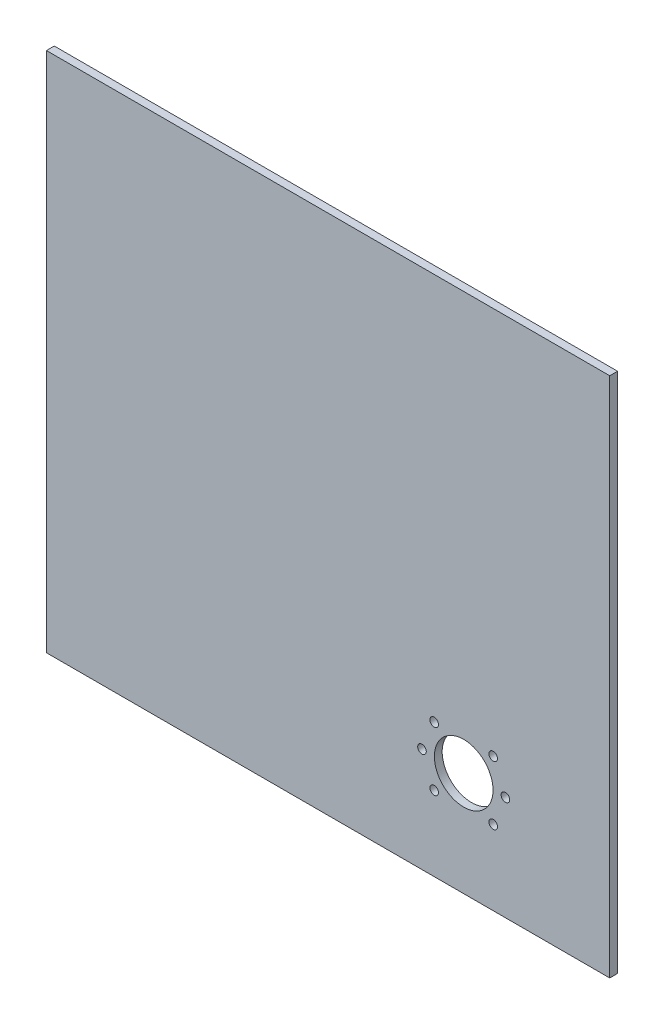
ISO-10303-21;
HEADER;
FILE_DESCRIPTION(('STEP AP214'),'2;1');
FILE_NAME('part.step','',(''),(''),'','','');
FILE_SCHEMA(('AUTOMOTIVE_DESIGN { 1 0 10303 214 1 1 1 1 }'));
ENDSEC;
DATA;
#1=APPLICATION_CONTEXT('core data for automotive mechanical design processes');
#2=APPLICATION_PROTOCOL_DEFINITION('international standard','automotive_design',2000,#1);
#3=PRODUCT_CONTEXT('',#1,'mechanical');
#4=PRODUCT('Part','Part','',(#3));
#5=PRODUCT_RELATED_PRODUCT_CATEGORY('part','',(#4));
#6=PRODUCT_DEFINITION_FORMATION('','',#4);
#7=PRODUCT_DEFINITION_CONTEXT('part definition',#1,'design');
#8=PRODUCT_DEFINITION('design','',#6,#7);
#9=PRODUCT_DEFINITION_SHAPE('','',#8);
#10=(LENGTH_UNIT() NAMED_UNIT(*) SI_UNIT(.MILLI.,.METRE.));
#11=(NAMED_UNIT(*) PLANE_ANGLE_UNIT() SI_UNIT($,.RADIAN.));
#12=(NAMED_UNIT(*) SI_UNIT($,.STERADIAN.) SOLID_ANGLE_UNIT());
#13=UNCERTAINTY_MEASURE_WITH_UNIT(LENGTH_MEASURE(1.E-05),#10,'distance_accuracy_value','');
#14=(GEOMETRIC_REPRESENTATION_CONTEXT(3) GLOBAL_UNCERTAINTY_ASSIGNED_CONTEXT((#13)) GLOBAL_UNIT_ASSIGNED_CONTEXT((#10,
#11,#12)) REPRESENTATION_CONTEXT('',''));
#15=CARTESIAN_POINT('',(0.,0.,0.));
#16=DIRECTION('',(0.,0.,1.));
#17=DIRECTION('',(1.,0.,0.));
#18=AXIS2_PLACEMENT_3D('',#15,#16,#17);
#19=CARTESIAN_POINT('',(108.,100.,3.));
#20=DIRECTION('',(-1.,0.,0.));
#21=DIRECTION('',(0.,-1.,0.));
#22=AXIS2_PLACEMENT_3D('',#19,#20,#21);
#23=PLANE('',#22);
#24=DIRECTION('',(0.,1.,0.));
#25=VECTOR('',#24,1.);
#26=CARTESIAN_POINT('',(108.,100.,0.));
#27=LINE('',#26,#25);
#28=CARTESIAN_POINT('',(108.,-100.,0.));
#29=VERTEX_POINT('',#28);
#30=CARTESIAN_POINT('',(108.,100.,0.));
#31=VERTEX_POINT('',#30);
#32=EDGE_CURVE('E98',#29,#31,#27,.T.);
#33=ORIENTED_EDGE('',*,*,#32,.T.);
#34=DIRECTION('',(0.,0.,-1.));
#35=VECTOR('',#34,1.);
#36=CARTESIAN_POINT('',(108.,100.,3.));
#37=LINE('',#36,#35);
#38=CARTESIAN_POINT('',(108.,100.,3.));
#39=VERTEX_POINT('',#38);
#40=EDGE_CURVE('E11',#39,#31,#37,.T.);
#41=ORIENTED_EDGE('',*,*,#40,.F.);
#42=DIRECTION('',(0.,1.,0.));
#43=VECTOR('',#42,1.);
#44=CARTESIAN_POINT('',(108.,100.,3.));
#45=LINE('',#44,#43);
#46=CARTESIAN_POINT('',(108.,-100.,3.));
#47=VERTEX_POINT('',#46);
#48=EDGE_CURVE('E86',#47,#39,#45,.T.);
#49=ORIENTED_EDGE('',*,*,#48,.F.);
#50=DIRECTION('',(0.,0.,-1.));
#51=VECTOR('',#50,1.);
#52=CARTESIAN_POINT('',(108.,-100.,3.));
#53=LINE('',#52,#51);
#54=EDGE_CURVE('E94',#47,#29,#53,.T.);
#55=ORIENTED_EDGE('',*,*,#54,.T.);
#56=EDGE_LOOP('',(#33,#41,#49,#55));
#57=FACE_BOUND('',#56,.T.);
#58=ADVANCED_FACE('F35',(#57),#23,.F.);
#59=CARTESIAN_POINT('',(-108.,100.,3.));
#60=DIRECTION('',(0.,-1.,0.));
#61=DIRECTION('',(0.,0.,-1.));
#62=AXIS2_PLACEMENT_3D('',#59,#60,#61);
#63=PLANE('',#62);
#64=DIRECTION('',(-1.,0.,0.));
#65=VECTOR('',#64,1.);
#66=CARTESIAN_POINT('',(-108.,100.,0.));
#67=LINE('',#66,#65);
#68=CARTESIAN_POINT('',(-108.,100.,0.));
#69=VERTEX_POINT('',#68);
#70=EDGE_CURVE('E90',#31,#69,#67,.T.);
#71=ORIENTED_EDGE('',*,*,#70,.T.);
#72=DIRECTION('',(0.,0.,-1.));
#73=VECTOR('',#72,1.);
#74=CARTESIAN_POINT('',(-108.,100.,3.));
#75=LINE('',#74,#73);
#76=CARTESIAN_POINT('',(-108.,100.,3.));
#77=VERTEX_POINT('',#76);
#78=EDGE_CURVE('E43',#77,#69,#75,.T.);
#79=ORIENTED_EDGE('',*,*,#78,.F.);
#80=DIRECTION('',(-1.,0.,0.));
#81=VECTOR('',#80,1.);
#82=CARTESIAN_POINT('',(-108.,100.,3.));
#83=LINE('',#82,#81);
#84=EDGE_CURVE('E81',#39,#77,#83,.T.);
#85=ORIENTED_EDGE('',*,*,#84,.F.);
#86=ORIENTED_EDGE('',*,*,#40,.T.);
#87=EDGE_LOOP('',(#71,#79,#85,#86));
#88=FACE_BOUND('',#87,.T.);
#89=ADVANCED_FACE('F89',(#88),#63,.F.);
#90=CARTESIAN_POINT('',(-108.,100.,3.));
#91=DIRECTION('',(1.,0.,0.));
#92=DIRECTION('',(0.,1.,0.));
#93=AXIS2_PLACEMENT_3D('',#90,#91,#92);
#94=PLANE('',#93);
#95=DIRECTION('',(0.,-1.,0.));
#96=VECTOR('',#95,1.);
#97=CARTESIAN_POINT('',(-108.,100.,0.));
#98=LINE('',#97,#96);
#99=CARTESIAN_POINT('',(-108.,-100.,0.));
#100=VERTEX_POINT('',#99);
#101=EDGE_CURVE('E68',#69,#100,#98,.T.);
#102=ORIENTED_EDGE('',*,*,#101,.T.);
#103=DIRECTION('',(0.,0.,-1.));
#104=VECTOR('',#103,1.);
#105=CARTESIAN_POINT('',(-108.,-100.,3.));
#106=LINE('',#105,#104);
#107=CARTESIAN_POINT('',(-108.,-100.,3.));
#108=VERTEX_POINT('',#107);
#109=EDGE_CURVE('E91',#108,#100,#106,.T.);
#110=ORIENTED_EDGE('',*,*,#109,.F.);
#111=DIRECTION('',(0.,-1.,0.));
#112=VECTOR('',#111,1.);
#113=CARTESIAN_POINT('',(-108.,100.,3.));
#114=LINE('',#113,#112);
#115=EDGE_CURVE('E84',#77,#108,#114,.T.);
#116=ORIENTED_EDGE('',*,*,#115,.F.);
#117=ORIENTED_EDGE('',*,*,#78,.T.);
#118=EDGE_LOOP('',(#102,#110,#116,#117));
#119=FACE_BOUND('',#118,.T.);
#120=ADVANCED_FACE('F92',(#119),#94,.F.);
#121=CARTESIAN_POINT('',(-108.,-100.,3.));
#122=DIRECTION('',(0.,1.,0.));
#123=DIRECTION('',(0.,0.,1.));
#124=AXIS2_PLACEMENT_3D('',#121,#122,#123);
#125=PLANE('',#124);
#126=DIRECTION('',(1.,0.,0.));
#127=VECTOR('',#126,1.);
#128=CARTESIAN_POINT('',(-108.,-100.,0.));
#129=LINE('',#128,#127);
#130=EDGE_CURVE('E74',#100,#29,#129,.T.);
#131=ORIENTED_EDGE('',*,*,#130,.T.);
#132=ORIENTED_EDGE('',*,*,#54,.F.);
#133=DIRECTION('',(1.,0.,0.));
#134=VECTOR('',#133,1.);
#135=CARTESIAN_POINT('',(-108.,-100.,3.));
#136=LINE('',#135,#134);
#137=EDGE_CURVE('E51',#108,#47,#136,.T.);
#138=ORIENTED_EDGE('',*,*,#137,.F.);
#139=ORIENTED_EDGE('',*,*,#109,.T.);
#140=EDGE_LOOP('',(#131,#132,#138,#139));
#141=FACE_BOUND('',#140,.T.);
#142=ADVANCED_FACE('F106',(#141),#125,.F.);
#143=CARTESIAN_POINT('',(0.,0.,3.));
#144=DIRECTION('',(0.,0.,1.));
#145=DIRECTION('',(1.,0.,0.));
#146=AXIS2_PLACEMENT_3D('',#143,#144,#145);
#147=PLANE('',#146);
#148=CARTESIAN_POINT('',(36.,-60.,3.));
#149=DIRECTION('',(0.,0.,1.));
#150=DIRECTION('',(1.,0.,0.));
#151=AXIS2_PLACEMENT_3D('',#148,#149,#150);
#152=CIRCLE('',#151,1.64999999999998);
#153=CARTESIAN_POINT('',(37.65,-60.,3.));
#154=VERTEX_POINT('',#153);
#155=EDGE_CURVE('E150',#154,#154,#152,.T.);
#156=ORIENTED_EDGE('',*,*,#155,.F.);
#157=EDGE_LOOP('',(#156));
#158=FACE_BOUND('',#157,.T.);
#159=CARTESIAN_POINT('',(40.6862915010152,-48.6862915010152,3.));
#160=DIRECTION('',(0.,0.,1.));
#161=DIRECTION('',(1.,0.,0.));
#162=AXIS2_PLACEMENT_3D('',#159,#160,#161);
#163=CIRCLE('',#162,1.64999999999998);
#164=CARTESIAN_POINT('',(42.3362915010152,-48.6862915010152,3.));
#165=VERTEX_POINT('',#164);
#166=EDGE_CURVE('E144',#165,#165,#163,.T.);
#167=ORIENTED_EDGE('',*,*,#166,.F.);
#168=EDGE_LOOP('',(#167));
#169=FACE_BOUND('',#168,.T.);
#170=CARTESIAN_POINT('',(40.6862915010152,-71.3137084989848,3.));
#171=DIRECTION('',(0.,0.,1.));
#172=DIRECTION('',(1.,0.,0.));
#173=AXIS2_PLACEMENT_3D('',#170,#171,#172);
#174=CIRCLE('',#173,1.64999999999998);
#175=CARTESIAN_POINT('',(42.3362915010152,-71.3137084989848,3.));
#176=VERTEX_POINT('',#175);
#177=EDGE_CURVE('E138',#176,#176,#174,.T.);
#178=ORIENTED_EDGE('',*,*,#177,.F.);
#179=EDGE_LOOP('',(#178));
#180=FACE_BOUND('',#179,.T.);
#181=CARTESIAN_POINT('',(63.3137084989847,-48.6862915010152,3.));
#182=DIRECTION('',(0.,0.,1.));
#183=DIRECTION('',(1.,0.,0.));
#184=AXIS2_PLACEMENT_3D('',#181,#182,#183);
#185=CIRCLE('',#184,1.64999999999998);
#186=CARTESIAN_POINT('',(64.9637084989847,-48.6862915010152,3.));
#187=VERTEX_POINT('',#186);
#188=EDGE_CURVE('E132',#187,#187,#185,.T.);
#189=ORIENTED_EDGE('',*,*,#188,.F.);
#190=EDGE_LOOP('',(#189));
#191=FACE_BOUND('',#190,.T.);
#192=CARTESIAN_POINT('',(68.,-60.,3.));
#193=DIRECTION('',(0.,0.,1.));
#194=DIRECTION('',(1.,0.,0.));
#195=AXIS2_PLACEMENT_3D('',#192,#193,#194);
#196=CIRCLE('',#195,1.64999999999998);
#197=CARTESIAN_POINT('',(69.65,-60.,3.));
#198=VERTEX_POINT('',#197);
#199=EDGE_CURVE('E126',#198,#198,#196,.T.);
#200=ORIENTED_EDGE('',*,*,#199,.F.);
#201=EDGE_LOOP('',(#200));
#202=FACE_BOUND('',#201,.T.);
#203=CARTESIAN_POINT('',(63.3137084989848,-71.3137084989848,3.));
#204=DIRECTION('',(0.,0.,1.));
#205=DIRECTION('',(1.,0.,0.));
#206=AXIS2_PLACEMENT_3D('',#203,#204,#205);
#207=CIRCLE('',#206,1.64999999999998);
#208=CARTESIAN_POINT('',(64.9637084989847,-71.3137084989848,3.));
#209=VERTEX_POINT('',#208);
#210=EDGE_CURVE('E120',#209,#209,#207,.T.);
#211=ORIENTED_EDGE('',*,*,#210,.F.);
#212=EDGE_LOOP('',(#211));
#213=FACE_BOUND('',#212,.T.);
#214=CARTESIAN_POINT('',(52.,-60.,3.));
#215=DIRECTION('',(0.,0.,1.));
#216=DIRECTION('',(1.,0.,0.));
#217=AXIS2_PLACEMENT_3D('',#214,#215,#216);
#218=CIRCLE('',#217,11.25);
#219=CARTESIAN_POINT('',(63.25,-60.,3.));
#220=VERTEX_POINT('',#219);
#221=EDGE_CURVE('E112',#220,#220,#218,.T.);
#222=ORIENTED_EDGE('',*,*,#221,.F.);
#223=EDGE_LOOP('',(#222));
#224=FACE_BOUND('',#223,.T.);
#225=ORIENTED_EDGE('',*,*,#48,.T.);
#226=ORIENTED_EDGE('',*,*,#84,.T.);
#227=ORIENTED_EDGE('',*,*,#115,.T.);
#228=ORIENTED_EDGE('',*,*,#137,.T.);
#229=EDGE_LOOP('',(#225,#226,#227,#228));
#230=FACE_BOUND('',#229,.T.);
#231=ADVANCED_FACE('F82',(#158,#169,#180,#191,#202,#213,#224,#230),#147,.T.);
#232=CARTESIAN_POINT('',(0.,0.,0.));
#233=DIRECTION('',(0.,0.,1.));
#234=DIRECTION('',(1.,0.,0.));
#235=AXIS2_PLACEMENT_3D('',#232,#233,#234);
#236=PLANE('',#235);
#237=CARTESIAN_POINT('',(36.,-60.,0.));
#238=DIRECTION('',(0.,0.,1.));
#239=DIRECTION('',(1.,0.,0.));
#240=AXIS2_PLACEMENT_3D('',#237,#238,#239);
#241=CIRCLE('',#240,1.65);
#242=CARTESIAN_POINT('',(37.65,-60.,0.));
#243=VERTEX_POINT('',#242);
#244=EDGE_CURVE('E147',#243,#243,#241,.T.);
#245=ORIENTED_EDGE('',*,*,#244,.T.);
#246=EDGE_LOOP('',(#245));
#247=FACE_BOUND('',#246,.T.);
#248=CARTESIAN_POINT('',(40.6862915010152,-48.6862915010152,0.));
#249=DIRECTION('',(0.,0.,1.));
#250=DIRECTION('',(1.,0.,0.));
#251=AXIS2_PLACEMENT_3D('',#248,#249,#250);
#252=CIRCLE('',#251,1.65);
#253=CARTESIAN_POINT('',(42.3362915010152,-48.6862915010152,0.));
#254=VERTEX_POINT('',#253);
#255=EDGE_CURVE('E141',#254,#254,#252,.T.);
#256=ORIENTED_EDGE('',*,*,#255,.T.);
#257=EDGE_LOOP('',(#256));
#258=FACE_BOUND('',#257,.T.);
#259=CARTESIAN_POINT('',(40.6862915010152,-71.3137084989848,0.));
#260=DIRECTION('',(0.,0.,1.));
#261=DIRECTION('',(1.,0.,0.));
#262=AXIS2_PLACEMENT_3D('',#259,#260,#261);
#263=CIRCLE('',#262,1.65);
#264=CARTESIAN_POINT('',(42.3362915010152,-71.3137084989848,0.));
#265=VERTEX_POINT('',#264);
#266=EDGE_CURVE('E135',#265,#265,#263,.T.);
#267=ORIENTED_EDGE('',*,*,#266,.T.);
#268=EDGE_LOOP('',(#267));
#269=FACE_BOUND('',#268,.T.);
#270=CARTESIAN_POINT('',(63.3137084989847,-48.6862915010152,0.));
#271=DIRECTION('',(0.,0.,1.));
#272=DIRECTION('',(1.,0.,0.));
#273=AXIS2_PLACEMENT_3D('',#270,#271,#272);
#274=CIRCLE('',#273,1.65);
#275=CARTESIAN_POINT('',(64.9637084989847,-48.6862915010152,0.));
#276=VERTEX_POINT('',#275);
#277=EDGE_CURVE('E129',#276,#276,#274,.T.);
#278=ORIENTED_EDGE('',*,*,#277,.T.);
#279=EDGE_LOOP('',(#278));
#280=FACE_BOUND('',#279,.T.);
#281=CARTESIAN_POINT('',(68.,-60.,0.));
#282=DIRECTION('',(0.,0.,1.));
#283=DIRECTION('',(1.,0.,0.));
#284=AXIS2_PLACEMENT_3D('',#281,#282,#283);
#285=CIRCLE('',#284,1.65);
#286=CARTESIAN_POINT('',(69.65,-60.,0.));
#287=VERTEX_POINT('',#286);
#288=EDGE_CURVE('E123',#287,#287,#285,.T.);
#289=ORIENTED_EDGE('',*,*,#288,.T.);
#290=EDGE_LOOP('',(#289));
#291=FACE_BOUND('',#290,.T.);
#292=CARTESIAN_POINT('',(63.3137084989848,-71.3137084989848,0.));
#293=DIRECTION('',(0.,0.,1.));
#294=DIRECTION('',(1.,0.,0.));
#295=AXIS2_PLACEMENT_3D('',#292,#293,#294);
#296=CIRCLE('',#295,1.65);
#297=CARTESIAN_POINT('',(64.9637084989848,-71.3137084989848,0.));
#298=VERTEX_POINT('',#297);
#299=EDGE_CURVE('E115',#298,#298,#296,.T.);
#300=ORIENTED_EDGE('',*,*,#299,.T.);
#301=EDGE_LOOP('',(#300));
#302=FACE_BOUND('',#301,.T.);
#303=CARTESIAN_POINT('',(52.,-60.,0.));
#304=DIRECTION('',(0.,0.,1.));
#305=DIRECTION('',(1.,0.,0.));
#306=AXIS2_PLACEMENT_3D('',#303,#304,#305);
#307=CIRCLE('',#306,11.25);
#308=CARTESIAN_POINT('',(63.25,-60.,0.));
#309=VERTEX_POINT('',#308);
#310=EDGE_CURVE('E101',#309,#309,#307,.T.);
#311=ORIENTED_EDGE('',*,*,#310,.T.);
#312=EDGE_LOOP('',(#311));
#313=FACE_BOUND('',#312,.T.);
#314=ORIENTED_EDGE('',*,*,#32,.F.);
#315=ORIENTED_EDGE('',*,*,#130,.F.);
#316=ORIENTED_EDGE('',*,*,#101,.F.);
#317=ORIENTED_EDGE('',*,*,#70,.F.);
#318=EDGE_LOOP('',(#314,#315,#316,#317));
#319=FACE_BOUND('',#318,.T.);
#320=ADVANCED_FACE('F109',(#247,#258,#269,#280,#291,#302,#313,#319),#236,.F.);
#321=CARTESIAN_POINT('',(52.,-60.,0.));
#322=DIRECTION('',(0.,0.,1.));
#323=DIRECTION('',(1.,0.,0.));
#324=AXIS2_PLACEMENT_3D('',#321,#322,#323);
#325=CYLINDRICAL_SURFACE('',#324,11.25);
#326=ORIENTED_EDGE('',*,*,#310,.F.);
#327=EDGE_LOOP('',(#326));
#328=FACE_BOUND('',#327,.T.);
#329=ORIENTED_EDGE('',*,*,#221,.T.);
#330=EDGE_LOOP('',(#329));
#331=FACE_BOUND('',#330,.T.);
#332=ADVANCED_FACE('F171',(#328,#331),#325,.F.);
#333=CARTESIAN_POINT('',(63.3137084989848,-71.3137084989848,3.));
#334=DIRECTION('',(0.,0.,1.));
#335=DIRECTION('',(1.,0.,0.));
#336=AXIS2_PLACEMENT_3D('',#333,#334,#335);
#337=CYLINDRICAL_SURFACE('',#336,1.64999999999999);
#338=ORIENTED_EDGE('',*,*,#299,.F.);
#339=EDGE_LOOP('',(#338));
#340=FACE_BOUND('',#339,.T.);
#341=ORIENTED_EDGE('',*,*,#210,.T.);
#342=EDGE_LOOP('',(#341));
#343=FACE_BOUND('',#342,.T.);
#344=ADVANCED_FACE('F173',(#340,#343),#337,.F.);
#345=CARTESIAN_POINT('',(68.,-60.,3.));
#346=DIRECTION('',(0.,0.,1.));
#347=DIRECTION('',(1.,0.,0.));
#348=AXIS2_PLACEMENT_3D('',#345,#346,#347);
#349=CYLINDRICAL_SURFACE('',#348,1.64999999999999);
#350=ORIENTED_EDGE('',*,*,#288,.F.);
#351=EDGE_LOOP('',(#350));
#352=FACE_BOUND('',#351,.T.);
#353=ORIENTED_EDGE('',*,*,#199,.T.);
#354=EDGE_LOOP('',(#353));
#355=FACE_BOUND('',#354,.T.);
#356=ADVANCED_FACE('F180',(#352,#355),#349,.F.);
#357=CARTESIAN_POINT('',(63.3137084989847,-48.6862915010152,3.));
#358=DIRECTION('',(0.,0.,1.));
#359=DIRECTION('',(1.,0.,0.));
#360=AXIS2_PLACEMENT_3D('',#357,#358,#359);
#361=CYLINDRICAL_SURFACE('',#360,1.64999999999999);
#362=ORIENTED_EDGE('',*,*,#277,.F.);
#363=EDGE_LOOP('',(#362));
#364=FACE_BOUND('',#363,.T.);
#365=ORIENTED_EDGE('',*,*,#188,.T.);
#366=EDGE_LOOP('',(#365));
#367=FACE_BOUND('',#366,.T.);
#368=ADVANCED_FACE('F226',(#364,#367),#361,.F.);
#369=CARTESIAN_POINT('',(40.6862915010152,-71.3137084989848,3.));
#370=DIRECTION('',(0.,0.,1.));
#371=DIRECTION('',(1.,0.,0.));
#372=AXIS2_PLACEMENT_3D('',#369,#370,#371);
#373=CYLINDRICAL_SURFACE('',#372,1.64999999999999);
#374=ORIENTED_EDGE('',*,*,#266,.F.);
#375=EDGE_LOOP('',(#374));
#376=FACE_BOUND('',#375,.T.);
#377=ORIENTED_EDGE('',*,*,#177,.T.);
#378=EDGE_LOOP('',(#377));
#379=FACE_BOUND('',#378,.T.);
#380=ADVANCED_FACE('F236',(#376,#379),#373,.F.);
#381=CARTESIAN_POINT('',(40.6862915010152,-48.6862915010152,3.));
#382=DIRECTION('',(0.,0.,1.));
#383=DIRECTION('',(1.,0.,0.));
#384=AXIS2_PLACEMENT_3D('',#381,#382,#383);
#385=CYLINDRICAL_SURFACE('',#384,1.64999999999999);
#386=ORIENTED_EDGE('',*,*,#255,.F.);
#387=EDGE_LOOP('',(#386));
#388=FACE_BOUND('',#387,.T.);
#389=ORIENTED_EDGE('',*,*,#166,.T.);
#390=EDGE_LOOP('',(#389));
#391=FACE_BOUND('',#390,.T.);
#392=ADVANCED_FACE('F246',(#388,#391),#385,.F.);
#393=CARTESIAN_POINT('',(36.,-60.,3.));
#394=DIRECTION('',(0.,0.,1.));
#395=DIRECTION('',(1.,0.,0.));
#396=AXIS2_PLACEMENT_3D('',#393,#394,#395);
#397=CYLINDRICAL_SURFACE('',#396,1.64999999999999);
#398=ORIENTED_EDGE('',*,*,#244,.F.);
#399=EDGE_LOOP('',(#398));
#400=FACE_BOUND('',#399,.T.);
#401=ORIENTED_EDGE('',*,*,#155,.T.);
#402=EDGE_LOOP('',(#401));
#403=FACE_BOUND('',#402,.T.);
#404=ADVANCED_FACE('F154',(#400,#403),#397,.F.);
#405=CLOSED_SHELL('',(#58,#89,#120,#142,#231,#320,#332,#344,#356,#368,#380,#392,#404));
#406=MANIFOLD_SOLID_BREP('B2',#405);
#407=ADVANCED_BREP_SHAPE_REPRESENTATION('',(#18,#406),#14);
#408=SHAPE_DEFINITION_REPRESENTATION(#9,#407);
ENDSEC;
END-ISO-10303-21;
